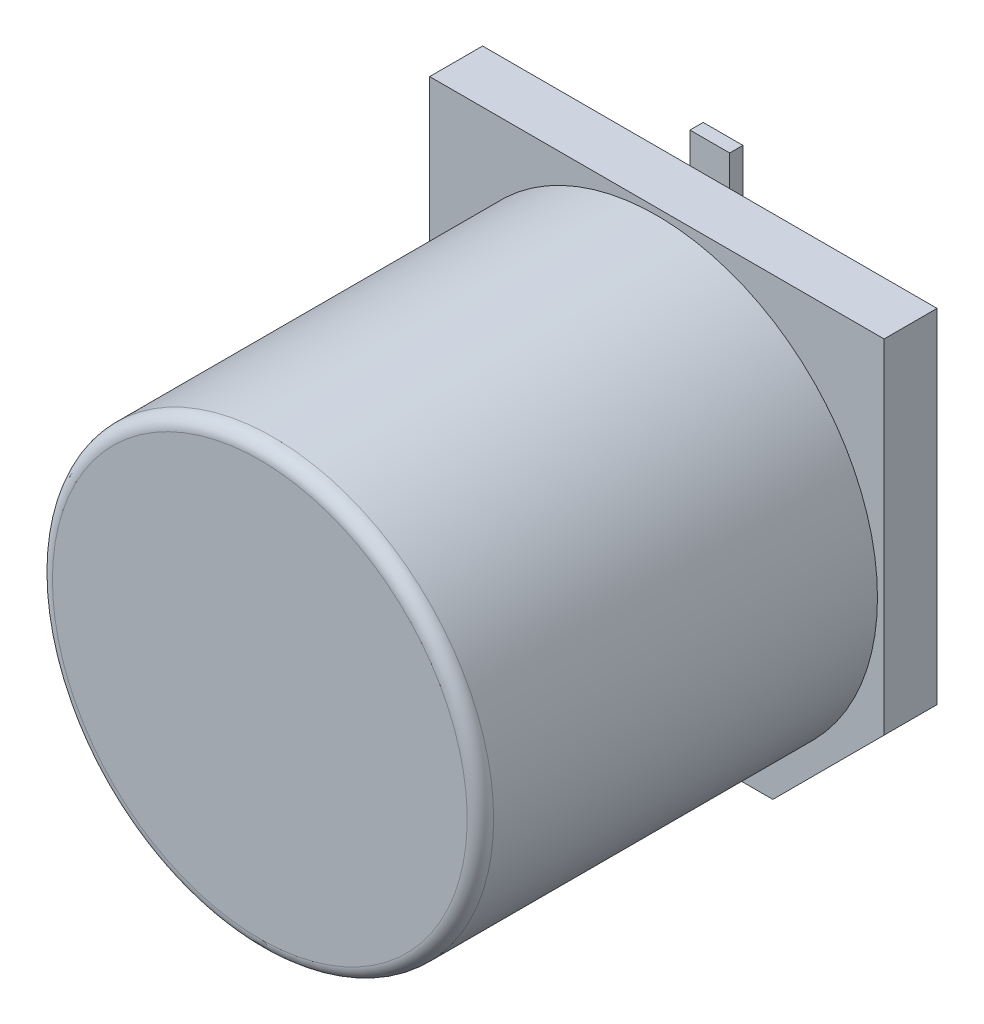
ISO-10303-21;
HEADER;
FILE_DESCRIPTION(('STEP AP214'),'2;1');
FILE_NAME('part.step','',(''),(''),'','','');
FILE_SCHEMA(('AUTOMOTIVE_DESIGN { 1 0 10303 214 1 1 1 1 }'));
ENDSEC;
DATA;
#1=APPLICATION_CONTEXT('core data for automotive mechanical design processes');
#2=APPLICATION_PROTOCOL_DEFINITION('international standard','automotive_design',2000,#1);
#3=PRODUCT_CONTEXT('',#1,'mechanical');
#4=PRODUCT('Part','Part','',(#3));
#5=PRODUCT_RELATED_PRODUCT_CATEGORY('part','',(#4));
#6=PRODUCT_DEFINITION_FORMATION('','',#4);
#7=PRODUCT_DEFINITION_CONTEXT('part definition',#1,'design');
#8=PRODUCT_DEFINITION('design','',#6,#7);
#9=PRODUCT_DEFINITION_SHAPE('','',#8);
#10=(LENGTH_UNIT() NAMED_UNIT(*) SI_UNIT(.MILLI.,.METRE.));
#11=(NAMED_UNIT(*) PLANE_ANGLE_UNIT() SI_UNIT($,.RADIAN.));
#12=(NAMED_UNIT(*) SI_UNIT($,.STERADIAN.) SOLID_ANGLE_UNIT());
#13=UNCERTAINTY_MEASURE_WITH_UNIT(LENGTH_MEASURE(1.E-05),#10,'distance_accuracy_value','');
#14=(GEOMETRIC_REPRESENTATION_CONTEXT(3) GLOBAL_UNCERTAINTY_ASSIGNED_CONTEXT((#13)) GLOBAL_UNIT_ASSIGNED_CONTEXT((#10,
#11,#12)) REPRESENTATION_CONTEXT('',''));
#15=CARTESIAN_POINT('',(0.,0.,0.));
#16=DIRECTION('',(0.,0.,1.));
#17=DIRECTION('',(1.,0.,0.));
#18=AXIS2_PLACEMENT_3D('',#15,#16,#17);
#19=CARTESIAN_POINT('',(0.,0.,0.));
#20=DIRECTION('',(0.,0.,1.));
#21=DIRECTION('',(1.,0.,0.));
#22=AXIS2_PLACEMENT_3D('',#19,#20,#21);
#23=PLANE('',#22);
#24=DIRECTION('',(1.,0.,0.));
#25=VECTOR('',#24,1.);
#26=CARTESIAN_POINT('',(0.45,-9.9,0.));
#27=LINE('',#26,#25);
#28=CARTESIAN_POINT('',(0.45,-9.9,0.));
#29=VERTEX_POINT('',#28);
#30=CARTESIAN_POINT('',(-0.450000000000001,-9.9,0.));
#31=VERTEX_POINT('',#30);
#32=EDGE_CURVE('E144',#29,#31,#27,.F.);
#33=ORIENTED_EDGE('',*,*,#32,.T.);
#34=DIRECTION('',(0.,1.,0.));
#35=VECTOR('',#34,1.);
#36=CARTESIAN_POINT('',(-0.45,-6.85,0.));
#37=LINE('',#36,#35);
#38=CARTESIAN_POINT('',(-0.45,-6.85,0.));
#39=VERTEX_POINT('',#38);
#40=EDGE_CURVE('E143',#31,#39,#37,.T.);
#41=ORIENTED_EDGE('',*,*,#40,.T.);
#42=CARTESIAN_POINT('',(0.,-6.85,0.));
#43=DIRECTION('',(0.,0.,1.));
#44=DIRECTION('',(1.,0.,0.));
#45=AXIS2_PLACEMENT_3D('',#42,#43,#44);
#46=CIRCLE('',#45,0.45);
#47=CARTESIAN_POINT('',(0.45,-6.85,0.));
#48=VERTEX_POINT('',#47);
#49=EDGE_CURVE('E21',#48,#39,#46,.T.);
#50=ORIENTED_EDGE('',*,*,#49,.F.);
#51=DIRECTION('',(0.,-1.,0.));
#52=VECTOR('',#51,1.);
#53=CARTESIAN_POINT('',(0.45,-6.85,0.));
#54=LINE('',#53,#52);
#55=EDGE_CURVE('E129',#48,#29,#54,.T.);
#56=ORIENTED_EDGE('',*,*,#55,.T.);
#57=EDGE_LOOP('',(#33,#41,#50,#56));
#58=FACE_BOUND('',#57,.T.);
#59=ADVANCED_FACE('F17',(#58),#23,.F.);
#60=CARTESIAN_POINT('',(0.,0.,0.));
#61=DIRECTION('',(0.,0.,1.));
#62=DIRECTION('',(1.,0.,0.));
#63=AXIS2_PLACEMENT_3D('',#60,#61,#62);
#64=PLANE('',#63);
#65=DIRECTION('',(1.,0.,0.));
#66=VECTOR('',#65,1.);
#67=CARTESIAN_POINT('',(0.45,1.7,0.));
#68=LINE('',#67,#66);
#69=CARTESIAN_POINT('',(-0.45,1.7,0.));
#70=VERTEX_POINT('',#69);
#71=CARTESIAN_POINT('',(0.45,1.7,0.));
#72=VERTEX_POINT('',#71);
#73=EDGE_CURVE('E219',#70,#72,#68,.T.);
#74=ORIENTED_EDGE('',*,*,#73,.T.);
#75=DIRECTION('',(0.,-1.,0.));
#76=VECTOR('',#75,1.);
#77=CARTESIAN_POINT('',(0.45,1.7,0.));
#78=LINE('',#77,#76);
#79=CARTESIAN_POINT('',(0.449999999999999,-1.35,0.));
#80=VERTEX_POINT('',#79);
#81=EDGE_CURVE('E202',#72,#80,#78,.T.);
#82=ORIENTED_EDGE('',*,*,#81,.T.);
#83=CARTESIAN_POINT('',(0.,-1.35,0.));
#84=DIRECTION('',(0.,0.,1.));
#85=DIRECTION('',(1.,0.,0.));
#86=AXIS2_PLACEMENT_3D('',#83,#84,#85);
#87=CIRCLE('',#86,0.45);
#88=CARTESIAN_POINT('',(-0.45,-1.35,0.));
#89=VERTEX_POINT('',#88);
#90=EDGE_CURVE('E248',#89,#80,#87,.T.);
#91=ORIENTED_EDGE('',*,*,#90,.F.);
#92=DIRECTION('',(0.,1.,0.));
#93=VECTOR('',#92,1.);
#94=CARTESIAN_POINT('',(-0.45,1.7,0.));
#95=LINE('',#94,#93);
#96=EDGE_CURVE('E212',#89,#70,#95,.T.);
#97=ORIENTED_EDGE('',*,*,#96,.T.);
#98=EDGE_LOOP('',(#74,#82,#91,#97));
#99=FACE_BOUND('',#98,.T.);
#100=ADVANCED_FACE('F286',(#99),#64,.F.);
#101=CARTESIAN_POINT('',(0.45,1.7,-3.613862199919));
#102=DIRECTION('',(0.,-1.,0.));
#103=DIRECTION('',(0.,0.,-1.));
#104=AXIS2_PLACEMENT_3D('',#101,#102,#103);
#105=PLANE('',#104);
#106=DIRECTION('',(0.,0.,1.));
#107=VECTOR('',#106,1.);
#108=CARTESIAN_POINT('',(-0.45,1.7,-3.613862199919));
#109=LINE('',#108,#107);
#110=CARTESIAN_POINT('',(-0.45,1.7,0.3));
#111=VERTEX_POINT('',#110);
#112=EDGE_CURVE('E148',#70,#111,#109,.T.);
#113=ORIENTED_EDGE('',*,*,#112,.T.);
#114=DIRECTION('',(-1.,0.,0.));
#115=VECTOR('',#114,1.);
#116=CARTESIAN_POINT('',(0.,1.7,0.3));
#117=LINE('',#116,#115);
#118=CARTESIAN_POINT('',(0.45,1.7,0.3));
#119=VERTEX_POINT('',#118);
#120=EDGE_CURVE('E206',#111,#119,#117,.F.);
#121=ORIENTED_EDGE('',*,*,#120,.T.);
#122=DIRECTION('',(0.,0.,1.));
#123=VECTOR('',#122,1.);
#124=CARTESIAN_POINT('',(0.45,1.7,-3.613862199919));
#125=LINE('',#124,#123);
#126=EDGE_CURVE('E199',#119,#72,#125,.F.);
#127=ORIENTED_EDGE('',*,*,#126,.T.);
#128=ORIENTED_EDGE('',*,*,#73,.F.);
#129=EDGE_LOOP('',(#113,#121,#127,#128));
#130=FACE_BOUND('',#129,.T.);
#131=ADVANCED_FACE('F279',(#130),#105,.F.);
#132=CARTESIAN_POINT('',(0.45,-9.9,-3.613862199919));
#133=DIRECTION('',(0.,1.,0.));
#134=DIRECTION('',(0.,0.,1.));
#135=AXIS2_PLACEMENT_3D('',#132,#133,#134);
#136=PLANE('',#135);
#137=DIRECTION('',(0.,0.,1.));
#138=VECTOR('',#137,1.);
#139=CARTESIAN_POINT('',(0.45,-9.9,-3.613862199919));
#140=LINE('',#139,#138);
#141=CARTESIAN_POINT('',(0.45,-9.9,0.3));
#142=VERTEX_POINT('',#141);
#143=EDGE_CURVE('E195',#29,#142,#140,.T.);
#144=ORIENTED_EDGE('',*,*,#143,.T.);
#145=DIRECTION('',(-1.,0.,0.));
#146=VECTOR('',#145,1.);
#147=CARTESIAN_POINT('',(0.,-9.9,0.3));
#148=LINE('',#147,#146);
#149=CARTESIAN_POINT('',(-0.450000000000001,-9.9,0.3));
#150=VERTEX_POINT('',#149);
#151=EDGE_CURVE('E171',#142,#150,#148,.T.);
#152=ORIENTED_EDGE('',*,*,#151,.T.);
#153=DIRECTION('',(0.,0.,1.));
#154=VECTOR('',#153,1.);
#155=CARTESIAN_POINT('',(-0.450000000000001,-9.9,-3.613862199919));
#156=LINE('',#155,#154);
#157=EDGE_CURVE('E149',#150,#31,#156,.F.);
#158=ORIENTED_EDGE('',*,*,#157,.T.);
#159=ORIENTED_EDGE('',*,*,#32,.F.);
#160=EDGE_LOOP('',(#144,#152,#158,#159));
#161=FACE_BOUND('',#160,.T.);
#162=ADVANCED_FACE('F436',(#161),#136,.F.);
#163=CARTESIAN_POINT('',(0.45,-6.85,-3.613862199919));
#164=DIRECTION('',(-1.,0.,0.));
#165=DIRECTION('',(0.,-1.,0.));
#166=AXIS2_PLACEMENT_3D('',#163,#164,#165);
#167=PLANE('',#166);
#168=DIRECTION('',(0.,0.,1.));
#169=VECTOR('',#168,1.);
#170=CARTESIAN_POINT('',(0.45,-6.85,-3.613862199919));
#171=LINE('',#170,#169);
#172=CARTESIAN_POINT('',(0.45,-6.85,0.3));
#173=VERTEX_POINT('',#172);
#174=EDGE_CURVE('E140',#173,#48,#171,.F.);
#175=ORIENTED_EDGE('',*,*,#174,.F.);
#176=DIRECTION('',(0.,1.,0.));
#177=VECTOR('',#176,1.);
#178=CARTESIAN_POINT('',(0.45,0.,0.3));
#179=LINE('',#178,#177);
#180=CARTESIAN_POINT('',(0.45,-9.3,0.3));
#181=VERTEX_POINT('',#180);
#182=EDGE_CURVE('E170',#181,#173,#179,.T.);
#183=ORIENTED_EDGE('',*,*,#182,.F.);
#184=DIRECTION('',(0.,1.,0.));
#185=VECTOR('',#184,1.);
#186=CARTESIAN_POINT('',(0.45,-6.85,0.3));
#187=LINE('',#186,#185);
#188=EDGE_CURVE('E184',#181,#142,#187,.F.);
#189=ORIENTED_EDGE('',*,*,#188,.T.);
#190=ORIENTED_EDGE('',*,*,#143,.F.);
#191=ORIENTED_EDGE('',*,*,#55,.F.);
#192=EDGE_LOOP('',(#175,#183,#189,#190,#191));
#193=FACE_BOUND('',#192,.T.);
#194=ADVANCED_FACE('F443',(#193),#167,.F.);
#195=CARTESIAN_POINT('',(0.,-6.85,-3.613862199919));
#196=DIRECTION('',(0.,0.,1.));
#197=DIRECTION('',(1.,0.,0.));
#198=AXIS2_PLACEMENT_3D('',#195,#196,#197);
#199=CYLINDRICAL_SURFACE('',#198,0.45);
#200=ORIENTED_EDGE('',*,*,#174,.T.);
#201=ORIENTED_EDGE('',*,*,#49,.T.);
#202=DIRECTION('',(0.,0.,1.));
#203=VECTOR('',#202,1.);
#204=CARTESIAN_POINT('',(-0.45,-6.85,-3.613862199919));
#205=LINE('',#204,#203);
#206=CARTESIAN_POINT('',(-0.45,-6.85,0.3));
#207=VERTEX_POINT('',#206);
#208=EDGE_CURVE('E138',#39,#207,#205,.T.);
#209=ORIENTED_EDGE('',*,*,#208,.T.);
#210=CARTESIAN_POINT('',(0.,-6.85,0.299999999999999));
#211=DIRECTION('',(0.,0.,1.));
#212=DIRECTION('',(1.,0.,0.));
#213=AXIS2_PLACEMENT_3D('',#210,#211,#212);
#214=CIRCLE('',#213,0.45);
#215=EDGE_CURVE('E247',#173,#207,#214,.T.);
#216=ORIENTED_EDGE('',*,*,#215,.F.);
#217=EDGE_LOOP('',(#200,#201,#209,#216));
#218=FACE_BOUND('',#217,.T.);
#219=ADVANCED_FACE('F135',(#218),#199,.T.);
#220=CARTESIAN_POINT('',(-0.45,-6.85,-3.613862199919));
#221=DIRECTION('',(1.,0.,0.));
#222=DIRECTION('',(0.,1.,0.));
#223=AXIS2_PLACEMENT_3D('',#220,#221,#222);
#224=PLANE('',#223);
#225=ORIENTED_EDGE('',*,*,#157,.F.);
#226=DIRECTION('',(0.,1.,0.));
#227=VECTOR('',#226,1.);
#228=CARTESIAN_POINT('',(-0.45,-6.85,0.3));
#229=LINE('',#228,#227);
#230=CARTESIAN_POINT('',(-0.45,-9.3,0.3));
#231=VERTEX_POINT('',#230);
#232=EDGE_CURVE('E168',#150,#231,#229,.T.);
#233=ORIENTED_EDGE('',*,*,#232,.T.);
#234=DIRECTION('',(0.,1.,0.));
#235=VECTOR('',#234,1.);
#236=CARTESIAN_POINT('',(-0.45,0.,0.3));
#237=LINE('',#236,#235);
#238=EDGE_CURVE('E153',#207,#231,#237,.F.);
#239=ORIENTED_EDGE('',*,*,#238,.F.);
#240=ORIENTED_EDGE('',*,*,#208,.F.);
#241=ORIENTED_EDGE('',*,*,#40,.F.);
#242=EDGE_LOOP('',(#225,#233,#239,#240,#241));
#243=FACE_BOUND('',#242,.T.);
#244=ADVANCED_FACE('F151',(#243),#224,.F.);
#245=CARTESIAN_POINT('',(-0.45,1.7,-3.613862199919));
#246=DIRECTION('',(1.,0.,0.));
#247=DIRECTION('',(0.,1.,0.));
#248=AXIS2_PLACEMENT_3D('',#245,#246,#247);
#249=PLANE('',#248);
#250=DIRECTION('',(0.,0.,1.));
#251=VECTOR('',#250,1.);
#252=CARTESIAN_POINT('',(-0.450000000000001,-1.35,-3.613862199919));
#253=LINE('',#252,#251);
#254=CARTESIAN_POINT('',(-0.45,-1.35,0.299999999999999));
#255=VERTEX_POINT('',#254);
#256=EDGE_CURVE('E225',#255,#89,#253,.F.);
#257=ORIENTED_EDGE('',*,*,#256,.F.);
#258=DIRECTION('',(0.,1.,0.));
#259=VECTOR('',#258,1.);
#260=CARTESIAN_POINT('',(-0.45,0.,0.3));
#261=LINE('',#260,#259);
#262=CARTESIAN_POINT('',(-0.45,1.,0.3));
#263=VERTEX_POINT('',#262);
#264=EDGE_CURVE('E246',#263,#255,#261,.F.);
#265=ORIENTED_EDGE('',*,*,#264,.F.);
#266=DIRECTION('',(0.,1.,0.));
#267=VECTOR('',#266,1.);
#268=CARTESIAN_POINT('',(-0.45,-1.35,0.3));
#269=LINE('',#268,#267);
#270=EDGE_CURVE('E208',#263,#111,#269,.T.);
#271=ORIENTED_EDGE('',*,*,#270,.T.);
#272=ORIENTED_EDGE('',*,*,#112,.F.);
#273=ORIENTED_EDGE('',*,*,#96,.F.);
#274=EDGE_LOOP('',(#257,#265,#271,#272,#273));
#275=FACE_BOUND('',#274,.T.);
#276=ADVANCED_FACE('F270',(#275),#249,.F.);
#277=CARTESIAN_POINT('',(0.,-1.35,-3.613862199919));
#278=DIRECTION('',(0.,0.,1.));
#279=DIRECTION('',(1.,0.,0.));
#280=AXIS2_PLACEMENT_3D('',#277,#278,#279);
#281=CYLINDRICAL_SURFACE('',#280,0.45);
#282=ORIENTED_EDGE('',*,*,#256,.T.);
#283=ORIENTED_EDGE('',*,*,#90,.T.);
#284=DIRECTION('',(0.,0.,1.));
#285=VECTOR('',#284,1.);
#286=CARTESIAN_POINT('',(0.449999999999999,-1.35,-3.613862199919));
#287=LINE('',#286,#285);
#288=CARTESIAN_POINT('',(0.449999999999999,-1.35,0.3));
#289=VERTEX_POINT('',#288);
#290=EDGE_CURVE('E203',#80,#289,#287,.T.);
#291=ORIENTED_EDGE('',*,*,#290,.T.);
#292=CARTESIAN_POINT('',(0.,-1.35,0.299999999999999));
#293=DIRECTION('',(0.,0.,1.));
#294=DIRECTION('',(1.,0.,0.));
#295=AXIS2_PLACEMENT_3D('',#292,#293,#294);
#296=CIRCLE('',#295,0.45);
#297=EDGE_CURVE('E242',#255,#289,#296,.T.);
#298=ORIENTED_EDGE('',*,*,#297,.F.);
#299=EDGE_LOOP('',(#282,#283,#291,#298));
#300=FACE_BOUND('',#299,.T.);
#301=ADVANCED_FACE('F287',(#300),#281,.T.);
#302=CARTESIAN_POINT('',(0.45,1.7,-3.613862199919));
#303=DIRECTION('',(-1.,0.,0.));
#304=DIRECTION('',(0.,-1.,0.));
#305=AXIS2_PLACEMENT_3D('',#302,#303,#304);
#306=PLANE('',#305);
#307=ORIENTED_EDGE('',*,*,#126,.F.);
#308=DIRECTION('',(0.,1.,0.));
#309=VECTOR('',#308,1.);
#310=CARTESIAN_POINT('',(0.45,-1.35,0.3));
#311=LINE('',#310,#309);
#312=CARTESIAN_POINT('',(0.45,1.,0.3));
#313=VERTEX_POINT('',#312);
#314=EDGE_CURVE('E187',#119,#313,#311,.F.);
#315=ORIENTED_EDGE('',*,*,#314,.T.);
#316=DIRECTION('',(0.,1.,0.));
#317=VECTOR('',#316,1.);
#318=CARTESIAN_POINT('',(0.45,0.,0.3));
#319=LINE('',#318,#317);
#320=EDGE_CURVE('E245',#289,#313,#319,.T.);
#321=ORIENTED_EDGE('',*,*,#320,.F.);
#322=ORIENTED_EDGE('',*,*,#290,.F.);
#323=ORIENTED_EDGE('',*,*,#81,.F.);
#324=EDGE_LOOP('',(#307,#315,#321,#322,#323));
#325=FACE_BOUND('',#324,.T.);
#326=ADVANCED_FACE('F282',(#325),#306,.F.);
#327=CARTESIAN_POINT('',(0.,-1.35,0.3));
#328=DIRECTION('',(0.,0.,-1.));
#329=DIRECTION('',(-1.,0.,0.));
#330=AXIS2_PLACEMENT_3D('',#327,#328,#329);
#331=PLANE('',#330);
#332=ORIENTED_EDGE('',*,*,#120,.F.);
#333=ORIENTED_EDGE('',*,*,#270,.F.);
#334=DIRECTION('',(1.,0.,0.));
#335=VECTOR('',#334,1.);
#336=CARTESIAN_POINT('',(-5.15,1.,0.3));
#337=LINE('',#336,#335);
#338=EDGE_CURVE('E262',#263,#313,#337,.T.);
#339=ORIENTED_EDGE('',*,*,#338,.T.);
#340=ORIENTED_EDGE('',*,*,#314,.F.);
#341=EDGE_LOOP('',(#332,#333,#339,#340));
#342=FACE_BOUND('',#341,.T.);
#343=ADVANCED_FACE('F276',(#342),#331,.F.);
#344=CARTESIAN_POINT('',(0.,-6.85,0.3));
#345=DIRECTION('',(0.,0.,-1.));
#346=DIRECTION('',(-1.,0.,0.));
#347=AXIS2_PLACEMENT_3D('',#344,#345,#346);
#348=PLANE('',#347);
#349=ORIENTED_EDGE('',*,*,#232,.F.);
#350=ORIENTED_EDGE('',*,*,#151,.F.);
#351=ORIENTED_EDGE('',*,*,#188,.F.);
#352=DIRECTION('',(1.,0.,0.));
#353=VECTOR('',#352,1.);
#354=CARTESIAN_POINT('',(5.15,-9.3,0.3));
#355=LINE('',#354,#353);
#356=EDGE_CURVE('E161',#181,#231,#355,.F.);
#357=ORIENTED_EDGE('',*,*,#356,.T.);
#358=EDGE_LOOP('',(#349,#350,#351,#357));
#359=FACE_BOUND('',#358,.T.);
#360=ADVANCED_FACE('F368',(#359),#348,.F.);
#361=CARTESIAN_POINT('',(0.,0.,0.3));
#362=DIRECTION('',(0.,0.,-1.));
#363=DIRECTION('',(-1.,0.,0.));
#364=AXIS2_PLACEMENT_3D('',#361,#362,#363);
#365=PLANE('',#364);
#366=ORIENTED_EDGE('',*,*,#320,.T.);
#367=DIRECTION('',(1.,0.,0.));
#368=VECTOR('',#367,1.);
#369=CARTESIAN_POINT('',(-5.15,1.,0.3));
#370=LINE('',#369,#368);
#371=CARTESIAN_POINT('',(5.15,1.,0.3));
#372=VERTEX_POINT('',#371);
#373=EDGE_CURVE('E307',#313,#372,#370,.T.);
#374=ORIENTED_EDGE('',*,*,#373,.T.);
#375=DIRECTION('',(0.,1.,0.));
#376=VECTOR('',#375,1.);
#377=CARTESIAN_POINT('',(5.15,1.,0.3));
#378=LINE('',#377,#376);
#379=CARTESIAN_POINT('',(5.15,-6.778174593052,0.3));
#380=VERTEX_POINT('',#379);
#381=EDGE_CURVE('E315',#372,#380,#378,.F.);
#382=ORIENTED_EDGE('',*,*,#381,.T.);
#383=DIRECTION('',(-0.707106781186548,-0.707106781186548,0.));
#384=VECTOR('',#383,1.);
#385=CARTESIAN_POINT('',(2.628174593052,-9.3,0.3));
#386=LINE('',#385,#384);
#387=CARTESIAN_POINT('',(2.628174593052,-9.3,0.3));
#388=VERTEX_POINT('',#387);
#389=EDGE_CURVE('E354',#380,#388,#386,.T.);
#390=ORIENTED_EDGE('',*,*,#389,.T.);
#391=DIRECTION('',(1.,0.,0.));
#392=VECTOR('',#391,1.);
#393=CARTESIAN_POINT('',(5.15,-9.3,0.3));
#394=LINE('',#393,#392);
#395=EDGE_CURVE('E165',#388,#181,#394,.F.);
#396=ORIENTED_EDGE('',*,*,#395,.T.);
#397=ORIENTED_EDGE('',*,*,#182,.T.);
#398=ORIENTED_EDGE('',*,*,#215,.T.);
#399=ORIENTED_EDGE('',*,*,#238,.T.);
#400=DIRECTION('',(1.,0.,0.));
#401=VECTOR('',#400,1.);
#402=CARTESIAN_POINT('',(5.15,-9.3,0.3));
#403=LINE('',#402,#401);
#404=CARTESIAN_POINT('',(-2.628174593052,-9.3,0.3));
#405=VERTEX_POINT('',#404);
#406=EDGE_CURVE('E164',#231,#405,#403,.F.);
#407=ORIENTED_EDGE('',*,*,#406,.T.);
#408=DIRECTION('',(-0.707106781186548,0.707106781186548,0.));
#409=VECTOR('',#408,1.);
#410=CARTESIAN_POINT('',(-5.15,-6.778174593052,0.3));
#411=LINE('',#410,#409);
#412=CARTESIAN_POINT('',(-5.15,-6.778174593052,0.3));
#413=VERTEX_POINT('',#412);
#414=EDGE_CURVE('E349',#405,#413,#411,.T.);
#415=ORIENTED_EDGE('',*,*,#414,.T.);
#416=DIRECTION('',(0.,1.,0.));
#417=VECTOR('',#416,1.);
#418=CARTESIAN_POINT('',(-5.15,-9.3,0.3));
#419=LINE('',#418,#417);
#420=CARTESIAN_POINT('',(-5.15,1.,0.3));
#421=VERTEX_POINT('',#420);
#422=EDGE_CURVE('E326',#413,#421,#419,.T.);
#423=ORIENTED_EDGE('',*,*,#422,.T.);
#424=DIRECTION('',(1.,0.,0.));
#425=VECTOR('',#424,1.);
#426=CARTESIAN_POINT('',(-5.15,1.,0.3));
#427=LINE('',#426,#425);
#428=EDGE_CURVE('E259',#421,#263,#427,.T.);
#429=ORIENTED_EDGE('',*,*,#428,.T.);
#430=ORIENTED_EDGE('',*,*,#264,.T.);
#431=ORIENTED_EDGE('',*,*,#297,.T.);
#432=EDGE_LOOP('',(#366,#374,#382,#390,#396,#397,#398,#399,#407,#415,#423,#429,#430,#431));
#433=FACE_BOUND('',#432,.T.);
#434=ADVANCED_FACE('F290',(#433),#365,.T.);
#435=CARTESIAN_POINT('',(-5.15,-9.3,10.5));
#436=DIRECTION('',(1.,0.,0.));
#437=DIRECTION('',(0.,0.,-1.));
#438=AXIS2_PLACEMENT_3D('',#435,#436,#437);
#439=PLANE('',#438);
#440=DIRECTION('',(0.,1.,0.));
#441=VECTOR('',#440,1.);
#442=CARTESIAN_POINT('',(-5.15,0.,1.5));
#443=LINE('',#442,#441);
#444=CARTESIAN_POINT('',(-5.15,-6.778174593052,1.5));
#445=VERTEX_POINT('',#444);
#446=CARTESIAN_POINT('',(-5.15,1.,1.5));
#447=VERTEX_POINT('',#446);
#448=EDGE_CURVE('E338',#445,#447,#443,.T.);
#449=ORIENTED_EDGE('',*,*,#448,.T.);
#450=DIRECTION('',(0.,0.,-1.));
#451=VECTOR('',#450,1.);
#452=CARTESIAN_POINT('',(-5.15,1.,10.5));
#453=LINE('',#452,#451);
#454=EDGE_CURVE('E263',#447,#421,#453,.T.);
#455=ORIENTED_EDGE('',*,*,#454,.T.);
#456=ORIENTED_EDGE('',*,*,#422,.F.);
#457=DIRECTION('',(0.,0.,1.));
#458=VECTOR('',#457,1.);
#459=CARTESIAN_POINT('',(-5.15,-6.778174593052,0.3));
#460=LINE('',#459,#458);
#461=EDGE_CURVE('E344',#413,#445,#460,.T.);
#462=ORIENTED_EDGE('',*,*,#461,.T.);
#463=EDGE_LOOP('',(#449,#455,#456,#462));
#464=FACE_BOUND('',#463,.T.);
#465=ADVANCED_FACE('F374',(#464),#439,.F.);
#466=CARTESIAN_POINT('',(-5.15,1.,10.5));
#467=DIRECTION('',(0.,-1.,0.));
#468=DIRECTION('',(0.,0.,-1.));
#469=AXIS2_PLACEMENT_3D('',#466,#467,#468);
#470=PLANE('',#469);
#471=DIRECTION('',(0.,0.,1.));
#472=VECTOR('',#471,1.);
#473=CARTESIAN_POINT('',(5.15,1.,10.5));
#474=LINE('',#473,#472);
#475=CARTESIAN_POINT('',(5.15,1.,1.5));
#476=VERTEX_POINT('',#475);
#477=EDGE_CURVE('E312',#476,#372,#474,.F.);
#478=ORIENTED_EDGE('',*,*,#477,.T.);
#479=ORIENTED_EDGE('',*,*,#373,.F.);
#480=ORIENTED_EDGE('',*,*,#338,.F.);
#481=ORIENTED_EDGE('',*,*,#428,.F.);
#482=ORIENTED_EDGE('',*,*,#454,.F.);
#483=DIRECTION('',(-1.,0.,0.));
#484=VECTOR('',#483,1.);
#485=CARTESIAN_POINT('',(0.,1.,1.5));
#486=LINE('',#485,#484);
#487=EDGE_CURVE('E330',#447,#476,#486,.F.);
#488=ORIENTED_EDGE('',*,*,#487,.T.);
#489=EDGE_LOOP('',(#478,#479,#480,#481,#482,#488));
#490=FACE_BOUND('',#489,.T.);
#491=ADVANCED_FACE('F327',(#490),#470,.F.);
#492=CARTESIAN_POINT('',(5.15,1.,10.5));
#493=DIRECTION('',(-1.,0.,0.));
#494=DIRECTION('',(0.,0.,1.));
#495=AXIS2_PLACEMENT_3D('',#492,#493,#494);
#496=PLANE('',#495);
#497=ORIENTED_EDGE('',*,*,#381,.F.);
#498=ORIENTED_EDGE('',*,*,#477,.F.);
#499=DIRECTION('',(0.,1.,0.));
#500=VECTOR('',#499,1.);
#501=CARTESIAN_POINT('',(5.15,0.,1.5));
#502=LINE('',#501,#500);
#503=CARTESIAN_POINT('',(5.15,-6.778174593052,1.5));
#504=VERTEX_POINT('',#503);
#505=EDGE_CURVE('E340',#476,#504,#502,.F.);
#506=ORIENTED_EDGE('',*,*,#505,.T.);
#507=DIRECTION('',(0.,0.,1.));
#508=VECTOR('',#507,1.);
#509=CARTESIAN_POINT('',(5.15,-6.778174593052,0.3));
#510=LINE('',#509,#508);
#511=EDGE_CURVE('E320',#504,#380,#510,.F.);
#512=ORIENTED_EDGE('',*,*,#511,.T.);
#513=EDGE_LOOP('',(#497,#498,#506,#512));
#514=FACE_BOUND('',#513,.T.);
#515=ADVANCED_FACE('F359',(#514),#496,.F.);
#516=CARTESIAN_POINT('',(2.628174593052,-9.3,0.3));
#517=DIRECTION('',(-0.707106781186548,0.707106781186548,0.));
#518=DIRECTION('',(-0.707106781186548,-0.707106781186548,0.));
#519=AXIS2_PLACEMENT_3D('',#516,#517,#518);
#520=PLANE('',#519);
#521=ORIENTED_EDGE('',*,*,#389,.F.);
#522=ORIENTED_EDGE('',*,*,#511,.F.);
#523=DIRECTION('',(-0.707106781186548,-0.707106781186547,0.));
#524=VECTOR('',#523,1.);
#525=CARTESIAN_POINT('',(5.15,-6.778174593052,1.5));
#526=LINE('',#525,#524);
#527=CARTESIAN_POINT('',(2.628174593052,-9.3,1.5));
#528=VERTEX_POINT('',#527);
#529=EDGE_CURVE('E342',#504,#528,#526,.T.);
#530=ORIENTED_EDGE('',*,*,#529,.T.);
#531=DIRECTION('',(0.,0.,1.));
#532=VECTOR('',#531,1.);
#533=CARTESIAN_POINT('',(2.628174593052,-9.3,10.5));
#534=LINE('',#533,#532);
#535=EDGE_CURVE('E181',#528,#388,#534,.F.);
#536=ORIENTED_EDGE('',*,*,#535,.T.);
#537=EDGE_LOOP('',(#521,#522,#530,#536));
#538=FACE_BOUND('',#537,.T.);
#539=ADVANCED_FACE('F361',(#538),#520,.F.);
#540=CARTESIAN_POINT('',(5.15,-9.3,10.5));
#541=DIRECTION('',(0.,1.,0.));
#542=DIRECTION('',(0.,0.,1.));
#543=AXIS2_PLACEMENT_3D('',#540,#541,#542);
#544=PLANE('',#543);
#545=ORIENTED_EDGE('',*,*,#406,.F.);
#546=ORIENTED_EDGE('',*,*,#356,.F.);
#547=ORIENTED_EDGE('',*,*,#395,.F.);
#548=ORIENTED_EDGE('',*,*,#535,.F.);
#549=DIRECTION('',(-1.,0.,0.));
#550=VECTOR('',#549,1.);
#551=CARTESIAN_POINT('',(0.,-9.3,1.5));
#552=LINE('',#551,#550);
#553=CARTESIAN_POINT('',(-2.628174593052,-9.3,1.5));
#554=VERTEX_POINT('',#553);
#555=EDGE_CURVE('E36',#528,#554,#552,.T.);
#556=ORIENTED_EDGE('',*,*,#555,.T.);
#557=DIRECTION('',(0.,0.,1.));
#558=VECTOR('',#557,1.);
#559=CARTESIAN_POINT('',(-2.628174593052,-9.3,0.3));
#560=LINE('',#559,#558);
#561=EDGE_CURVE('E175',#554,#405,#560,.F.);
#562=ORIENTED_EDGE('',*,*,#561,.T.);
#563=EDGE_LOOP('',(#545,#546,#547,#548,#556,#562));
#564=FACE_BOUND('',#563,.T.);
#565=ADVANCED_FACE('F370',(#564),#544,.F.);
#566=CARTESIAN_POINT('',(-5.15,-6.778174593052,0.3));
#567=DIRECTION('',(0.707106781186548,0.707106781186548,0.));
#568=DIRECTION('',(-0.707106781186548,0.707106781186548,0.));
#569=AXIS2_PLACEMENT_3D('',#566,#567,#568);
#570=PLANE('',#569);
#571=ORIENTED_EDGE('',*,*,#414,.F.);
#572=ORIENTED_EDGE('',*,*,#561,.F.);
#573=DIRECTION('',(-0.707106781186547,0.707106781186548,0.));
#574=VECTOR('',#573,1.);
#575=CARTESIAN_POINT('',(-2.628174593052,-9.3,1.5));
#576=LINE('',#575,#574);
#577=EDGE_CURVE('E241',#554,#445,#576,.T.);
#578=ORIENTED_EDGE('',*,*,#577,.T.);
#579=ORIENTED_EDGE('',*,*,#461,.F.);
#580=EDGE_LOOP('',(#571,#572,#578,#579));
#581=FACE_BOUND('',#580,.T.);
#582=ADVANCED_FACE('F376',(#581),#570,.F.);
#583=CARTESIAN_POINT('',(0.,0.,10.5));
#584=DIRECTION('',(0.,0.,-1.));
#585=DIRECTION('',(-1.,0.,0.));
#586=AXIS2_PLACEMENT_3D('',#583,#584,#585);
#587=PLANE('',#586);
#588=CARTESIAN_POINT('',(0.,-4.15,10.5));
#589=DIRECTION('',(0.,0.,-1.));
#590=DIRECTION('',(-1.,0.,0.));
#591=AXIS2_PLACEMENT_3D('',#588,#589,#590);
#592=CIRCLE('',#591,4.69999999999961);
#593=CARTESIAN_POINT('',(-4.69999999999961,-4.15,10.5));
#594=VERTEX_POINT('',#593);
#595=EDGE_CURVE('E238',#594,#594,#592,.T.);
#596=ORIENTED_EDGE('',*,*,#595,.F.);
#597=EDGE_LOOP('',(#596));
#598=FACE_BOUND('',#597,.T.);
#599=ADVANCED_FACE('F380',(#598),#587,.F.);
#600=CARTESIAN_POINT('',(0.,0.,1.5));
#601=DIRECTION('',(0.,0.,-1.));
#602=DIRECTION('',(-1.,0.,0.));
#603=AXIS2_PLACEMENT_3D('',#600,#601,#602);
#604=PLANE('',#603);
#605=CARTESIAN_POINT('',(0.,-4.15,1.5));
#606=DIRECTION('',(0.,0.,1.));
#607=DIRECTION('',(1.,0.,0.));
#608=AXIS2_PLACEMENT_3D('',#605,#606,#607);
#609=CIRCLE('',#608,5.);
#610=CARTESIAN_POINT('',(5.,-4.15,1.5));
#611=VERTEX_POINT('',#610);
#612=EDGE_CURVE('E27',#611,#611,#609,.T.);
#613=ORIENTED_EDGE('',*,*,#612,.F.);
#614=EDGE_LOOP('',(#613));
#615=FACE_BOUND('',#614,.T.);
#616=ORIENTED_EDGE('',*,*,#555,.F.);
#617=ORIENTED_EDGE('',*,*,#529,.F.);
#618=ORIENTED_EDGE('',*,*,#505,.F.);
#619=ORIENTED_EDGE('',*,*,#487,.F.);
#620=ORIENTED_EDGE('',*,*,#448,.F.);
#621=ORIENTED_EDGE('',*,*,#577,.F.);
#622=EDGE_LOOP('',(#616,#617,#618,#619,#620,#621));
#623=FACE_BOUND('',#622,.T.);
#624=ADVANCED_FACE('F336',(#615,#623),#604,.F.);
#625=CARTESIAN_POINT('',(0.,-4.15,10.2));
#626=DIRECTION('',(0.,0.,-1.));
#627=DIRECTION('',(-1.,0.,0.));
#628=AXIS2_PLACEMENT_3D('',#625,#626,#627);
#629=TOROIDAL_SURFACE('',#628,4.7,0.299999999999998);
#630=CARTESIAN_POINT('',(0.,-4.15,10.2));
#631=DIRECTION('',(0.,0.,1.));
#632=DIRECTION('',(1.,0.,0.));
#633=AXIS2_PLACEMENT_3D('',#630,#631,#632);
#634=CIRCLE('',#633,5.);
#635=CARTESIAN_POINT('',(5.,-4.15,10.2));
#636=VERTEX_POINT('',#635);
#637=EDGE_CURVE('E11',#636,#636,#634,.F.);
#638=ORIENTED_EDGE('',*,*,#637,.F.);
#639=EDGE_LOOP('',(#638));
#640=FACE_BOUND('',#639,.T.);
#641=ORIENTED_EDGE('',*,*,#595,.T.);
#642=EDGE_LOOP('',(#641));
#643=FACE_BOUND('',#642,.T.);
#644=ADVANCED_FACE('F19',(#640,#643),#629,.T.);
#645=CARTESIAN_POINT('',(0.,-4.15,-14.41206368936));
#646=DIRECTION('',(0.,0.,1.));
#647=DIRECTION('',(1.,0.,0.));
#648=AXIS2_PLACEMENT_3D('',#645,#646,#647);
#649=CYLINDRICAL_SURFACE('',#648,5.);
#650=ORIENTED_EDGE('',*,*,#637,.T.);
#651=EDGE_LOOP('',(#650));
#652=FACE_BOUND('',#651,.T.);
#653=ORIENTED_EDGE('',*,*,#612,.T.);
#654=EDGE_LOOP('',(#653));
#655=FACE_BOUND('',#654,.T.);
#656=ADVANCED_FACE('F390',(#652,#655),#649,.T.);
#657=CLOSED_SHELL('',(#59,#100,#131,#162,#194,#219,#244,#276,#301,#326,#343,#360,#434,#465,#491,
#515,#539,#565,#582,#599,#624,#644,#656));
#658=MANIFOLD_SOLID_BREP('B1',#657);
#659=ADVANCED_BREP_SHAPE_REPRESENTATION('',(#18,#658),#14);
#660=SHAPE_DEFINITION_REPRESENTATION(#9,#659);
ENDSEC;
END-ISO-10303-21;
